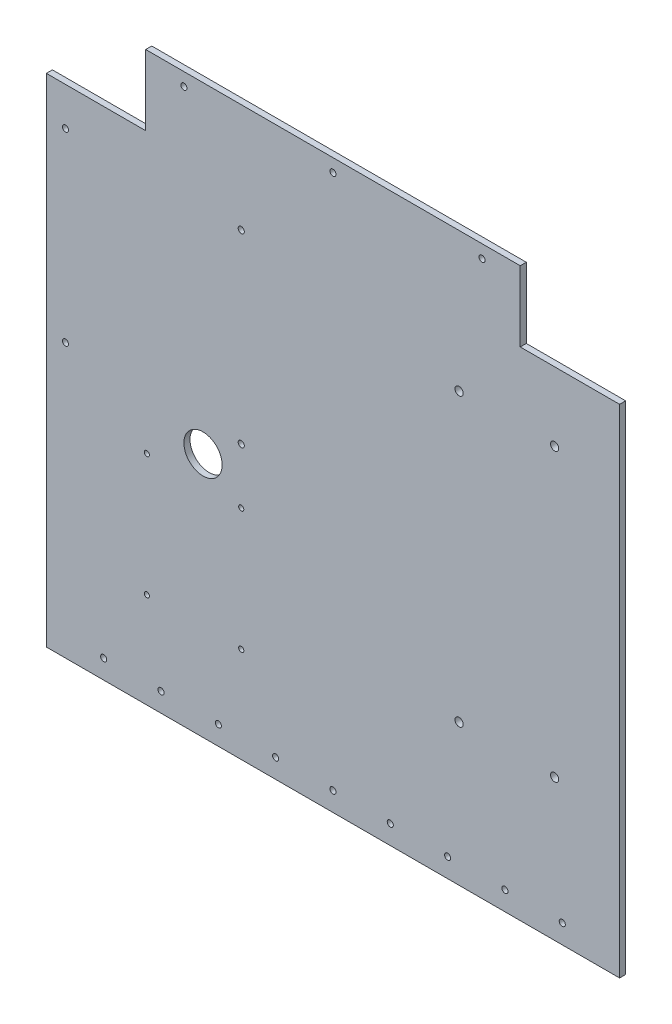
ISO-10303-21;
HEADER;
FILE_DESCRIPTION(('STEP AP214'),'2;1');
FILE_NAME('part.step','',(''),(''),'','','');
FILE_SCHEMA(('AUTOMOTIVE_DESIGN { 1 0 10303 214 1 1 1 1 }'));
ENDSEC;
DATA;
#1=APPLICATION_CONTEXT('core data for automotive mechanical design processes');
#2=APPLICATION_PROTOCOL_DEFINITION('international standard','automotive_design',2000,#1);
#3=PRODUCT_CONTEXT('',#1,'mechanical');
#4=PRODUCT('Part','Part','',(#3));
#5=PRODUCT_RELATED_PRODUCT_CATEGORY('part','',(#4));
#6=PRODUCT_DEFINITION_FORMATION('','',#4);
#7=PRODUCT_DEFINITION_CONTEXT('part definition',#1,'design');
#8=PRODUCT_DEFINITION('design','',#6,#7);
#9=PRODUCT_DEFINITION_SHAPE('','',#8);
#10=(LENGTH_UNIT() NAMED_UNIT(*) SI_UNIT(.MILLI.,.METRE.));
#11=(NAMED_UNIT(*) PLANE_ANGLE_UNIT() SI_UNIT($,.RADIAN.));
#12=(NAMED_UNIT(*) SI_UNIT($,.STERADIAN.) SOLID_ANGLE_UNIT());
#13=UNCERTAINTY_MEASURE_WITH_UNIT(LENGTH_MEASURE(1.E-05),#10,'distance_accuracy_value','');
#14=(GEOMETRIC_REPRESENTATION_CONTEXT(3) GLOBAL_UNCERTAINTY_ASSIGNED_CONTEXT((#13)) GLOBAL_UNIT_ASSIGNED_CONTEXT((#10,
#11,#12)) REPRESENTATION_CONTEXT('',''));
#15=CARTESIAN_POINT('',(0.,0.,0.));
#16=DIRECTION('',(0.,0.,1.));
#17=DIRECTION('',(1.,0.,0.));
#18=AXIS2_PLACEMENT_3D('',#15,#16,#17);
#19=CARTESIAN_POINT('',(0.,0.,0.));
#20=DIRECTION('',(0.,0.,1.));
#21=DIRECTION('',(1.,0.,0.));
#22=AXIS2_PLACEMENT_3D('',#19,#20,#21);
#23=PLANE('',#22);
#24=DIRECTION('',(1.,0.,0.));
#25=VECTOR('',#24,1.);
#26=CARTESIAN_POINT('',(0.,-3.19999999999999,0.));
#27=LINE('',#26,#25);
#28=CARTESIAN_POINT('',(52.,-3.19999999999999,0.));
#29=VERTEX_POINT('',#28);
#30=CARTESIAN_POINT('',(248.,-3.19999999999999,0.));
#31=VERTEX_POINT('',#30);
#32=EDGE_CURVE('E115',#29,#31,#27,.T.);
#33=ORIENTED_EDGE('',*,*,#32,.F.);
#34=DIRECTION('',(0.,1.,0.));
#35=VECTOR('',#34,1.);
#36=CARTESIAN_POINT('',(52.,0.,0.));
#37=LINE('',#36,#35);
#38=CARTESIAN_POINT('',(52.,-40.,0.));
#39=VERTEX_POINT('',#38);
#40=EDGE_CURVE('E166',#39,#29,#37,.T.);
#41=ORIENTED_EDGE('',*,*,#40,.F.);
#42=DIRECTION('',(1.,0.,0.));
#43=VECTOR('',#42,1.);
#44=CARTESIAN_POINT('',(0.,-40.,0.));
#45=LINE('',#44,#43);
#46=CARTESIAN_POINT('',(0.,-40.,0.));
#47=VERTEX_POINT('',#46);
#48=EDGE_CURVE('E57',#47,#39,#45,.T.);
#49=ORIENTED_EDGE('',*,*,#48,.F.);
#50=DIRECTION('',(0.,1.,0.));
#51=VECTOR('',#50,1.);
#52=CARTESIAN_POINT('',(0.,0.,0.));
#53=LINE('',#52,#51);
#54=CARTESIAN_POINT('',(0.,-300.,0.));
#55=VERTEX_POINT('',#54);
#56=EDGE_CURVE('E150',#55,#47,#53,.T.);
#57=ORIENTED_EDGE('',*,*,#56,.F.);
#58=DIRECTION('',(-1.,0.,0.));
#59=VECTOR('',#58,1.);
#60=CARTESIAN_POINT('',(0.,-300.,0.));
#61=LINE('',#60,#59);
#62=CARTESIAN_POINT('',(300.,-300.,0.));
#63=VERTEX_POINT('',#62);
#64=EDGE_CURVE('E145',#63,#55,#61,.T.);
#65=ORIENTED_EDGE('',*,*,#64,.F.);
#66=DIRECTION('',(0.,-1.,0.));
#67=VECTOR('',#66,1.);
#68=CARTESIAN_POINT('',(300.,0.,0.));
#69=LINE('',#68,#67);
#70=CARTESIAN_POINT('',(300.,-40.,0.));
#71=VERTEX_POINT('',#70);
#72=EDGE_CURVE('E153',#71,#63,#69,.T.);
#73=ORIENTED_EDGE('',*,*,#72,.F.);
#74=DIRECTION('',(1.,0.,0.));
#75=VECTOR('',#74,1.);
#76=CARTESIAN_POINT('',(0.,-39.9999999999999,0.));
#77=LINE('',#76,#75);
#78=CARTESIAN_POINT('',(248.,-40.,0.));
#79=VERTEX_POINT('',#78);
#80=EDGE_CURVE('E162',#79,#71,#77,.T.);
#81=ORIENTED_EDGE('',*,*,#80,.F.);
#82=DIRECTION('',(0.,-1.,0.));
#83=VECTOR('',#82,1.);
#84=CARTESIAN_POINT('',(248.,0.,0.));
#85=LINE('',#84,#83);
#86=EDGE_CURVE('E164',#31,#79,#85,.T.);
#87=ORIENTED_EDGE('',*,*,#86,.F.);
#88=EDGE_LOOP('',(#33,#41,#49,#57,#65,#73,#81,#87));
#89=FACE_BOUND('',#88,.T.);
#90=CARTESIAN_POINT('',(82.,-171.5,0.));
#91=DIRECTION('',(0.,0.,1.));
#92=DIRECTION('',(1.,0.,0.));
#93=AXIS2_PLACEMENT_3D('',#90,#91,#92);
#94=CIRCLE('',#93,10.);
#95=CARTESIAN_POINT('',(92.,-171.5,0.));
#96=VERTEX_POINT('',#95);
#97=EDGE_CURVE('E346',#96,#96,#94,.T.);
#98=ORIENTED_EDGE('',*,*,#97,.F.);
#99=EDGE_LOOP('',(#98));
#100=FACE_BOUND('',#99,.T.);
#101=CARTESIAN_POINT('',(228.,-10.,0.));
#102=DIRECTION('',(0.,0.,-1.));
#103=DIRECTION('',(-1.,0.,0.));
#104=AXIS2_PLACEMENT_3D('',#101,#102,#103);
#105=CIRCLE('',#104,1.59999999999999);
#106=CARTESIAN_POINT('',(226.4,-10.,0.));
#107=VERTEX_POINT('',#106);
#108=EDGE_CURVE('E340',#107,#107,#105,.T.);
#109=ORIENTED_EDGE('',*,*,#108,.T.);
#110=EDGE_LOOP('',(#109));
#111=FACE_BOUND('',#110,.T.);
#112=CARTESIAN_POINT('',(150.,-10.,0.));
#113=DIRECTION('',(0.,0.,-1.));
#114=DIRECTION('',(-1.,0.,0.));
#115=AXIS2_PLACEMENT_3D('',#112,#113,#114);
#116=CIRCLE('',#115,1.59999999999999);
#117=CARTESIAN_POINT('',(148.4,-10.,0.));
#118=VERTEX_POINT('',#117);
#119=EDGE_CURVE('E334',#118,#118,#116,.T.);
#120=ORIENTED_EDGE('',*,*,#119,.T.);
#121=EDGE_LOOP('',(#120));
#122=FACE_BOUND('',#121,.T.);
#123=CARTESIAN_POINT('',(270.,-290.,0.));
#124=DIRECTION('',(0.,0.,-1.));
#125=DIRECTION('',(-1.,0.,0.));
#126=AXIS2_PLACEMENT_3D('',#123,#124,#125);
#127=CIRCLE('',#126,1.59999999999999);
#128=CARTESIAN_POINT('',(268.4,-290.,0.));
#129=VERTEX_POINT('',#128);
#130=EDGE_CURVE('E322',#129,#129,#127,.T.);
#131=ORIENTED_EDGE('',*,*,#130,.T.);
#132=EDGE_LOOP('',(#131));
#133=FACE_BOUND('',#132,.T.);
#134=CARTESIAN_POINT('',(240.,-290.,0.));
#135=DIRECTION('',(0.,0.,-1.));
#136=DIRECTION('',(-1.,0.,0.));
#137=AXIS2_PLACEMENT_3D('',#134,#135,#136);
#138=CIRCLE('',#137,1.59999999999999);
#139=CARTESIAN_POINT('',(238.4,-290.,0.));
#140=VERTEX_POINT('',#139);
#141=EDGE_CURVE('E316',#140,#140,#138,.T.);
#142=ORIENTED_EDGE('',*,*,#141,.T.);
#143=EDGE_LOOP('',(#142));
#144=FACE_BOUND('',#143,.T.);
#145=CARTESIAN_POINT('',(180.,-290.,0.));
#146=DIRECTION('',(0.,0.,-1.));
#147=DIRECTION('',(-1.,0.,0.));
#148=AXIS2_PLACEMENT_3D('',#145,#146,#147);
#149=CIRCLE('',#148,1.59999999999999);
#150=CARTESIAN_POINT('',(178.4,-290.,0.));
#151=VERTEX_POINT('',#150);
#152=EDGE_CURVE('E304',#151,#151,#149,.T.);
#153=ORIENTED_EDGE('',*,*,#152,.T.);
#154=EDGE_LOOP('',(#153));
#155=FACE_BOUND('',#154,.T.);
#156=CARTESIAN_POINT('',(90.,-290.,0.));
#157=DIRECTION('',(0.,0.,-1.));
#158=DIRECTION('',(-1.,0.,0.));
#159=AXIS2_PLACEMENT_3D('',#156,#157,#158);
#160=CIRCLE('',#159,1.6);
#161=CARTESIAN_POINT('',(88.4,-290.,0.));
#162=VERTEX_POINT('',#161);
#163=EDGE_CURVE('E286',#162,#162,#160,.T.);
#164=ORIENTED_EDGE('',*,*,#163,.T.);
#165=EDGE_LOOP('',(#164));
#166=FACE_BOUND('',#165,.T.);
#167=CARTESIAN_POINT('',(102.,-186.,0.));
#168=DIRECTION('',(0.,0.,-1.));
#169=DIRECTION('',(-1.,0.,0.));
#170=AXIS2_PLACEMENT_3D('',#167,#168,#169);
#171=CIRCLE('',#170,1.35);
#172=CARTESIAN_POINT('',(100.65,-186.,0.));
#173=VERTEX_POINT('',#172);
#174=EDGE_CURVE('E268',#173,#173,#171,.T.);
#175=ORIENTED_EDGE('',*,*,#174,.T.);
#176=EDGE_LOOP('',(#175));
#177=FACE_BOUND('',#176,.T.);
#178=CARTESIAN_POINT('',(52.6,-250.,0.));
#179=DIRECTION('',(0.,0.,-1.));
#180=DIRECTION('',(-1.,0.,0.));
#181=AXIS2_PLACEMENT_3D('',#178,#179,#180);
#182=CIRCLE('',#181,1.35);
#183=CARTESIAN_POINT('',(51.25,-250.,0.));
#184=VERTEX_POINT('',#183);
#185=EDGE_CURVE('E262',#184,#184,#182,.T.);
#186=ORIENTED_EDGE('',*,*,#185,.T.);
#187=EDGE_LOOP('',(#186));
#188=FACE_BOUND('',#187,.T.);
#189=CARTESIAN_POINT('',(102.,-250.,0.));
#190=DIRECTION('',(0.,0.,-1.));
#191=DIRECTION('',(-1.,0.,0.));
#192=AXIS2_PLACEMENT_3D('',#189,#190,#191);
#193=CIRCLE('',#192,1.35);
#194=CARTESIAN_POINT('',(100.65,-250.,0.));
#195=VERTEX_POINT('',#194);
#196=EDGE_CURVE('E256',#195,#195,#193,.T.);
#197=ORIENTED_EDGE('',*,*,#196,.T.);
#198=EDGE_LOOP('',(#197));
#199=FACE_BOUND('',#198,.T.);
#200=CARTESIAN_POINT('',(52.6,-186.,0.));
#201=DIRECTION('',(0.,0.,-1.));
#202=DIRECTION('',(-1.,0.,0.));
#203=AXIS2_PLACEMENT_3D('',#200,#201,#202);
#204=CIRCLE('',#203,1.35);
#205=CARTESIAN_POINT('',(51.25,-186.,0.));
#206=VERTEX_POINT('',#205);
#207=EDGE_CURVE('E250',#206,#206,#204,.T.);
#208=ORIENTED_EDGE('',*,*,#207,.T.);
#209=EDGE_LOOP('',(#208));
#210=FACE_BOUND('',#209,.T.);
#211=CARTESIAN_POINT('',(102.,-60.,0.));
#212=DIRECTION('',(0.,0.,-1.));
#213=DIRECTION('',(-1.,0.,0.));
#214=AXIS2_PLACEMENT_3D('',#211,#212,#213);
#215=CIRCLE('',#214,1.6);
#216=CARTESIAN_POINT('',(100.4,-60.,0.));
#217=VERTEX_POINT('',#216);
#218=EDGE_CURVE('E244',#217,#217,#215,.T.);
#219=ORIENTED_EDGE('',*,*,#218,.T.);
#220=EDGE_LOOP('',(#219));
#221=FACE_BOUND('',#220,.T.);
#222=CARTESIAN_POINT('',(9.99999999999999,-157.,0.));
#223=DIRECTION('',(0.,0.,-1.));
#224=DIRECTION('',(-1.,0.,0.));
#225=AXIS2_PLACEMENT_3D('',#222,#223,#224);
#226=CIRCLE('',#225,1.6);
#227=CARTESIAN_POINT('',(8.39999999999999,-157.,0.));
#228=VERTEX_POINT('',#227);
#229=EDGE_CURVE('E238',#228,#228,#226,.T.);
#230=ORIENTED_EDGE('',*,*,#229,.T.);
#231=EDGE_LOOP('',(#230));
#232=FACE_BOUND('',#231,.T.);
#233=CARTESIAN_POINT('',(102.,-157.,0.));
#234=DIRECTION('',(0.,0.,-1.));
#235=DIRECTION('',(-1.,0.,0.));
#236=AXIS2_PLACEMENT_3D('',#233,#234,#235);
#237=CIRCLE('',#236,1.6);
#238=CARTESIAN_POINT('',(100.4,-157.,0.));
#239=VERTEX_POINT('',#238);
#240=EDGE_CURVE('E232',#239,#239,#237,.T.);
#241=ORIENTED_EDGE('',*,*,#240,.T.);
#242=EDGE_LOOP('',(#241));
#243=FACE_BOUND('',#242,.T.);
#244=CARTESIAN_POINT('',(9.99999999999999,-60.,0.));
#245=DIRECTION('',(0.,0.,-1.));
#246=DIRECTION('',(-1.,0.,0.));
#247=AXIS2_PLACEMENT_3D('',#244,#245,#246);
#248=CIRCLE('',#247,1.6);
#249=CARTESIAN_POINT('',(8.4,-60.,0.));
#250=VERTEX_POINT('',#249);
#251=EDGE_CURVE('E226',#250,#250,#248,.T.);
#252=ORIENTED_EDGE('',*,*,#251,.T.);
#253=EDGE_LOOP('',(#252));
#254=FACE_BOUND('',#253,.T.);
#255=CARTESIAN_POINT('',(266.,-76.,0.));
#256=DIRECTION('',(0.,0.,-1.));
#257=DIRECTION('',(0.,1.,0.));
#258=AXIS2_PLACEMENT_3D('',#255,#256,#257);
#259=CIRCLE('',#258,2.14999999999999);
#260=CARTESIAN_POINT('',(266.,-73.85,0.));
#261=VERTEX_POINT('',#260);
#262=EDGE_CURVE('E220',#261,#261,#259,.T.);
#263=ORIENTED_EDGE('',*,*,#262,.T.);
#264=EDGE_LOOP('',(#263));
#265=FACE_BOUND('',#264,.T.);
#266=CARTESIAN_POINT('',(216.,-226.,0.));
#267=DIRECTION('',(0.,0.,-1.));
#268=DIRECTION('',(0.,1.,0.));
#269=AXIS2_PLACEMENT_3D('',#266,#267,#268);
#270=CIRCLE('',#269,2.15000000000001);
#271=CARTESIAN_POINT('',(216.,-223.85,0.));
#272=VERTEX_POINT('',#271);
#273=EDGE_CURVE('E214',#272,#272,#270,.T.);
#274=ORIENTED_EDGE('',*,*,#273,.T.);
#275=EDGE_LOOP('',(#274));
#276=FACE_BOUND('',#275,.T.);
#277=CARTESIAN_POINT('',(216.,-76.,0.));
#278=DIRECTION('',(0.,0.,-1.));
#279=DIRECTION('',(0.,1.,0.));
#280=AXIS2_PLACEMENT_3D('',#277,#278,#279);
#281=CIRCLE('',#280,2.15000000000001);
#282=CARTESIAN_POINT('',(216.,-73.85,0.));
#283=VERTEX_POINT('',#282);
#284=EDGE_CURVE('E205',#283,#283,#281,.T.);
#285=ORIENTED_EDGE('',*,*,#284,.T.);
#286=EDGE_LOOP('',(#285));
#287=FACE_BOUND('',#286,.T.);
#288=CARTESIAN_POINT('',(266.,-226.,0.));
#289=DIRECTION('',(0.,0.,-1.));
#290=DIRECTION('',(0.,1.,0.));
#291=AXIS2_PLACEMENT_3D('',#288,#289,#290);
#292=CIRCLE('',#291,2.14999999999999);
#293=CARTESIAN_POINT('',(266.,-223.85,0.));
#294=VERTEX_POINT('',#293);
#295=EDGE_CURVE('E180',#294,#294,#292,.T.);
#296=ORIENTED_EDGE('',*,*,#295,.T.);
#297=EDGE_LOOP('',(#296));
#298=FACE_BOUND('',#297,.T.);
#299=CARTESIAN_POINT('',(30.,-290.,0.));
#300=DIRECTION('',(0.,0.,-1.));
#301=DIRECTION('',(-1.,0.,0.));
#302=AXIS2_PLACEMENT_3D('',#299,#300,#301);
#303=CIRCLE('',#302,1.6);
#304=CARTESIAN_POINT('',(28.4,-290.,0.));
#305=VERTEX_POINT('',#304);
#306=EDGE_CURVE('E274',#305,#305,#303,.T.);
#307=ORIENTED_EDGE('',*,*,#306,.T.);
#308=EDGE_LOOP('',(#307));
#309=FACE_BOUND('',#308,.T.);
#310=CARTESIAN_POINT('',(60.,-290.,0.));
#311=DIRECTION('',(0.,0.,-1.));
#312=DIRECTION('',(-1.,0.,0.));
#313=AXIS2_PLACEMENT_3D('',#310,#311,#312);
#314=CIRCLE('',#313,1.6);
#315=CARTESIAN_POINT('',(58.4,-290.,0.));
#316=VERTEX_POINT('',#315);
#317=EDGE_CURVE('E280',#316,#316,#314,.T.);
#318=ORIENTED_EDGE('',*,*,#317,.T.);
#319=EDGE_LOOP('',(#318));
#320=FACE_BOUND('',#319,.T.);
#321=CARTESIAN_POINT('',(120.,-290.,0.));
#322=DIRECTION('',(0.,0.,-1.));
#323=DIRECTION('',(-1.,0.,0.));
#324=AXIS2_PLACEMENT_3D('',#321,#322,#323);
#325=CIRCLE('',#324,1.6);
#326=CARTESIAN_POINT('',(118.4,-290.,0.));
#327=VERTEX_POINT('',#326);
#328=EDGE_CURVE('E292',#327,#327,#325,.T.);
#329=ORIENTED_EDGE('',*,*,#328,.T.);
#330=EDGE_LOOP('',(#329));
#331=FACE_BOUND('',#330,.T.);
#332=CARTESIAN_POINT('',(150.,-290.,0.));
#333=DIRECTION('',(0.,0.,-1.));
#334=DIRECTION('',(-1.,0.,0.));
#335=AXIS2_PLACEMENT_3D('',#332,#333,#334);
#336=CIRCLE('',#335,1.59999999999999);
#337=CARTESIAN_POINT('',(148.4,-290.,0.));
#338=VERTEX_POINT('',#337);
#339=EDGE_CURVE('E298',#338,#338,#336,.T.);
#340=ORIENTED_EDGE('',*,*,#339,.T.);
#341=EDGE_LOOP('',(#340));
#342=FACE_BOUND('',#341,.T.);
#343=CARTESIAN_POINT('',(210.,-290.,0.));
#344=DIRECTION('',(0.,0.,-1.));
#345=DIRECTION('',(-1.,0.,0.));
#346=AXIS2_PLACEMENT_3D('',#343,#344,#345);
#347=CIRCLE('',#346,1.59999999999999);
#348=CARTESIAN_POINT('',(208.4,-290.,0.));
#349=VERTEX_POINT('',#348);
#350=EDGE_CURVE('E310',#349,#349,#347,.T.);
#351=ORIENTED_EDGE('',*,*,#350,.T.);
#352=EDGE_LOOP('',(#351));
#353=FACE_BOUND('',#352,.T.);
#354=CARTESIAN_POINT('',(72.,-10.,0.));
#355=DIRECTION('',(0.,0.,-1.));
#356=DIRECTION('',(-1.,0.,0.));
#357=AXIS2_PLACEMENT_3D('',#354,#355,#356);
#358=CIRCLE('',#357,1.6);
#359=CARTESIAN_POINT('',(70.4,-10.,0.));
#360=VERTEX_POINT('',#359);
#361=EDGE_CURVE('E328',#360,#360,#358,.T.);
#362=ORIENTED_EDGE('',*,*,#361,.T.);
#363=EDGE_LOOP('',(#362));
#364=FACE_BOUND('',#363,.T.);
#365=ADVANCED_FACE('F49',(#89,#100,#111,#122,#133,#144,#155,#166,#177,#188,#199,#210,#221,#232,
#243,#254,#265,#276,#287,#298,#309,#320,#331,#342,#353,#364),#23,.T.);
#366=CARTESIAN_POINT('',(0.,0.,-3.175));
#367=DIRECTION('',(0.,0.,1.));
#368=DIRECTION('',(1.,0.,0.));
#369=AXIS2_PLACEMENT_3D('',#366,#367,#368);
#370=PLANE('',#369);
#371=CARTESIAN_POINT('',(82.,-171.5,-3.175));
#372=DIRECTION('',(0.,0.,-1.));
#373=DIRECTION('',(-1.,0.,0.));
#374=AXIS2_PLACEMENT_3D('',#371,#372,#373);
#375=CIRCLE('',#374,10.);
#376=CARTESIAN_POINT('',(72.,-171.5,-3.175));
#377=VERTEX_POINT('',#376);
#378=EDGE_CURVE('E349',#377,#377,#375,.T.);
#379=ORIENTED_EDGE('',*,*,#378,.F.);
#380=EDGE_LOOP('',(#379));
#381=FACE_BOUND('',#380,.T.);
#382=CARTESIAN_POINT('',(228.,-10.,-3.175));
#383=DIRECTION('',(0.,0.,-1.));
#384=DIRECTION('',(-1.,0.,0.));
#385=AXIS2_PLACEMENT_3D('',#382,#383,#384);
#386=CIRCLE('',#385,1.59999999999999);
#387=CARTESIAN_POINT('',(226.4,-10.,-3.175));
#388=VERTEX_POINT('',#387);
#389=EDGE_CURVE('E343',#388,#388,#386,.T.);
#390=ORIENTED_EDGE('',*,*,#389,.F.);
#391=EDGE_LOOP('',(#390));
#392=FACE_BOUND('',#391,.T.);
#393=CARTESIAN_POINT('',(150.,-10.,-3.175));
#394=DIRECTION('',(0.,0.,-1.));
#395=DIRECTION('',(-1.,0.,0.));
#396=AXIS2_PLACEMENT_3D('',#393,#394,#395);
#397=CIRCLE('',#396,1.59999999999999);
#398=CARTESIAN_POINT('',(148.4,-10.,-3.175));
#399=VERTEX_POINT('',#398);
#400=EDGE_CURVE('E337',#399,#399,#397,.T.);
#401=ORIENTED_EDGE('',*,*,#400,.F.);
#402=EDGE_LOOP('',(#401));
#403=FACE_BOUND('',#402,.T.);
#404=CARTESIAN_POINT('',(270.,-290.,-3.175));
#405=DIRECTION('',(0.,0.,-1.));
#406=DIRECTION('',(-1.,0.,0.));
#407=AXIS2_PLACEMENT_3D('',#404,#405,#406);
#408=CIRCLE('',#407,1.59999999999999);
#409=CARTESIAN_POINT('',(268.4,-290.,-3.175));
#410=VERTEX_POINT('',#409);
#411=EDGE_CURVE('E325',#410,#410,#408,.T.);
#412=ORIENTED_EDGE('',*,*,#411,.F.);
#413=EDGE_LOOP('',(#412));
#414=FACE_BOUND('',#413,.T.);
#415=CARTESIAN_POINT('',(240.,-290.,-3.175));
#416=DIRECTION('',(0.,0.,-1.));
#417=DIRECTION('',(-1.,0.,0.));
#418=AXIS2_PLACEMENT_3D('',#415,#416,#417);
#419=CIRCLE('',#418,1.59999999999999);
#420=CARTESIAN_POINT('',(238.4,-290.,-3.175));
#421=VERTEX_POINT('',#420);
#422=EDGE_CURVE('E319',#421,#421,#419,.T.);
#423=ORIENTED_EDGE('',*,*,#422,.F.);
#424=EDGE_LOOP('',(#423));
#425=FACE_BOUND('',#424,.T.);
#426=CARTESIAN_POINT('',(210.,-290.,-3.175));
#427=DIRECTION('',(0.,0.,-1.));
#428=DIRECTION('',(-1.,0.,0.));
#429=AXIS2_PLACEMENT_3D('',#426,#427,#428);
#430=CIRCLE('',#429,1.59999999999999);
#431=CARTESIAN_POINT('',(208.4,-290.,-3.175));
#432=VERTEX_POINT('',#431);
#433=EDGE_CURVE('E313',#432,#432,#430,.T.);
#434=ORIENTED_EDGE('',*,*,#433,.F.);
#435=EDGE_LOOP('',(#434));
#436=FACE_BOUND('',#435,.T.);
#437=CARTESIAN_POINT('',(180.,-290.,-3.175));
#438=DIRECTION('',(0.,0.,-1.));
#439=DIRECTION('',(-1.,0.,0.));
#440=AXIS2_PLACEMENT_3D('',#437,#438,#439);
#441=CIRCLE('',#440,1.59999999999999);
#442=CARTESIAN_POINT('',(178.4,-290.,-3.175));
#443=VERTEX_POINT('',#442);
#444=EDGE_CURVE('E307',#443,#443,#441,.T.);
#445=ORIENTED_EDGE('',*,*,#444,.F.);
#446=EDGE_LOOP('',(#445));
#447=FACE_BOUND('',#446,.T.);
#448=CARTESIAN_POINT('',(150.,-290.,-3.175));
#449=DIRECTION('',(0.,0.,-1.));
#450=DIRECTION('',(-1.,0.,0.));
#451=AXIS2_PLACEMENT_3D('',#448,#449,#450);
#452=CIRCLE('',#451,1.59999999999999);
#453=CARTESIAN_POINT('',(148.4,-290.,-3.175));
#454=VERTEX_POINT('',#453);
#455=EDGE_CURVE('E301',#454,#454,#452,.T.);
#456=ORIENTED_EDGE('',*,*,#455,.F.);
#457=EDGE_LOOP('',(#456));
#458=FACE_BOUND('',#457,.T.);
#459=CARTESIAN_POINT('',(120.,-290.,-3.175));
#460=DIRECTION('',(0.,0.,-1.));
#461=DIRECTION('',(-1.,0.,0.));
#462=AXIS2_PLACEMENT_3D('',#459,#460,#461);
#463=CIRCLE('',#462,1.6);
#464=CARTESIAN_POINT('',(118.4,-290.,-3.175));
#465=VERTEX_POINT('',#464);
#466=EDGE_CURVE('E295',#465,#465,#463,.T.);
#467=ORIENTED_EDGE('',*,*,#466,.F.);
#468=EDGE_LOOP('',(#467));
#469=FACE_BOUND('',#468,.T.);
#470=CARTESIAN_POINT('',(90.,-290.,-3.175));
#471=DIRECTION('',(0.,0.,-1.));
#472=DIRECTION('',(-1.,0.,0.));
#473=AXIS2_PLACEMENT_3D('',#470,#471,#472);
#474=CIRCLE('',#473,1.6);
#475=CARTESIAN_POINT('',(88.4,-290.,-3.175));
#476=VERTEX_POINT('',#475);
#477=EDGE_CURVE('E289',#476,#476,#474,.T.);
#478=ORIENTED_EDGE('',*,*,#477,.F.);
#479=EDGE_LOOP('',(#478));
#480=FACE_BOUND('',#479,.T.);
#481=CARTESIAN_POINT('',(60.,-290.,-3.175));
#482=DIRECTION('',(0.,0.,-1.));
#483=DIRECTION('',(-1.,0.,0.));
#484=AXIS2_PLACEMENT_3D('',#481,#482,#483);
#485=CIRCLE('',#484,1.6);
#486=CARTESIAN_POINT('',(58.4,-290.,-3.175));
#487=VERTEX_POINT('',#486);
#488=EDGE_CURVE('E283',#487,#487,#485,.T.);
#489=ORIENTED_EDGE('',*,*,#488,.F.);
#490=EDGE_LOOP('',(#489));
#491=FACE_BOUND('',#490,.T.);
#492=CARTESIAN_POINT('',(30.,-290.,-3.175));
#493=DIRECTION('',(0.,0.,-1.));
#494=DIRECTION('',(-1.,0.,0.));
#495=AXIS2_PLACEMENT_3D('',#492,#493,#494);
#496=CIRCLE('',#495,1.6);
#497=CARTESIAN_POINT('',(28.4,-290.,-3.175));
#498=VERTEX_POINT('',#497);
#499=EDGE_CURVE('E277',#498,#498,#496,.T.);
#500=ORIENTED_EDGE('',*,*,#499,.F.);
#501=EDGE_LOOP('',(#500));
#502=FACE_BOUND('',#501,.T.);
#503=CARTESIAN_POINT('',(102.,-186.,-3.175));
#504=DIRECTION('',(0.,0.,-1.));
#505=DIRECTION('',(-1.,0.,0.));
#506=AXIS2_PLACEMENT_3D('',#503,#504,#505);
#507=CIRCLE('',#506,1.35);
#508=CARTESIAN_POINT('',(100.65,-186.,-3.175));
#509=VERTEX_POINT('',#508);
#510=EDGE_CURVE('E271',#509,#509,#507,.T.);
#511=ORIENTED_EDGE('',*,*,#510,.F.);
#512=EDGE_LOOP('',(#511));
#513=FACE_BOUND('',#512,.T.);
#514=CARTESIAN_POINT('',(52.6,-250.,-3.175));
#515=DIRECTION('',(0.,0.,-1.));
#516=DIRECTION('',(-1.,0.,0.));
#517=AXIS2_PLACEMENT_3D('',#514,#515,#516);
#518=CIRCLE('',#517,1.35);
#519=CARTESIAN_POINT('',(51.25,-250.,-3.175));
#520=VERTEX_POINT('',#519);
#521=EDGE_CURVE('E265',#520,#520,#518,.T.);
#522=ORIENTED_EDGE('',*,*,#521,.F.);
#523=EDGE_LOOP('',(#522));
#524=FACE_BOUND('',#523,.T.);
#525=CARTESIAN_POINT('',(102.,-250.,-3.175));
#526=DIRECTION('',(0.,0.,-1.));
#527=DIRECTION('',(-1.,0.,0.));
#528=AXIS2_PLACEMENT_3D('',#525,#526,#527);
#529=CIRCLE('',#528,1.35);
#530=CARTESIAN_POINT('',(100.65,-250.,-3.175));
#531=VERTEX_POINT('',#530);
#532=EDGE_CURVE('E259',#531,#531,#529,.T.);
#533=ORIENTED_EDGE('',*,*,#532,.F.);
#534=EDGE_LOOP('',(#533));
#535=FACE_BOUND('',#534,.T.);
#536=CARTESIAN_POINT('',(52.6,-186.,-3.175));
#537=DIRECTION('',(0.,0.,-1.));
#538=DIRECTION('',(-1.,0.,0.));
#539=AXIS2_PLACEMENT_3D('',#536,#537,#538);
#540=CIRCLE('',#539,1.35);
#541=CARTESIAN_POINT('',(51.25,-186.,-3.175));
#542=VERTEX_POINT('',#541);
#543=EDGE_CURVE('E253',#542,#542,#540,.T.);
#544=ORIENTED_EDGE('',*,*,#543,.F.);
#545=EDGE_LOOP('',(#544));
#546=FACE_BOUND('',#545,.T.);
#547=CARTESIAN_POINT('',(9.99999999999999,-157.,-3.175));
#548=DIRECTION('',(0.,0.,-1.));
#549=DIRECTION('',(-1.,0.,0.));
#550=AXIS2_PLACEMENT_3D('',#547,#548,#549);
#551=CIRCLE('',#550,1.6);
#552=CARTESIAN_POINT('',(8.39999999999999,-157.,-3.175));
#553=VERTEX_POINT('',#552);
#554=EDGE_CURVE('E241',#553,#553,#551,.T.);
#555=ORIENTED_EDGE('',*,*,#554,.F.);
#556=EDGE_LOOP('',(#555));
#557=FACE_BOUND('',#556,.T.);
#558=CARTESIAN_POINT('',(102.,-157.,-3.175));
#559=DIRECTION('',(0.,0.,-1.));
#560=DIRECTION('',(-1.,0.,0.));
#561=AXIS2_PLACEMENT_3D('',#558,#559,#560);
#562=CIRCLE('',#561,1.6);
#563=CARTESIAN_POINT('',(100.4,-157.,-3.175));
#564=VERTEX_POINT('',#563);
#565=EDGE_CURVE('E235',#564,#564,#562,.T.);
#566=ORIENTED_EDGE('',*,*,#565,.F.);
#567=EDGE_LOOP('',(#566));
#568=FACE_BOUND('',#567,.T.);
#569=CARTESIAN_POINT('',(9.99999999999999,-60.,-3.175));
#570=DIRECTION('',(0.,0.,-1.));
#571=DIRECTION('',(-1.,0.,0.));
#572=AXIS2_PLACEMENT_3D('',#569,#570,#571);
#573=CIRCLE('',#572,1.6);
#574=CARTESIAN_POINT('',(8.4,-60.,-3.175));
#575=VERTEX_POINT('',#574);
#576=EDGE_CURVE('E229',#575,#575,#573,.T.);
#577=ORIENTED_EDGE('',*,*,#576,.F.);
#578=EDGE_LOOP('',(#577));
#579=FACE_BOUND('',#578,.T.);
#580=CARTESIAN_POINT('',(266.,-76.,-3.17500000000001));
#581=DIRECTION('',(0.,0.,-1.));
#582=DIRECTION('',(0.,1.,0.));
#583=AXIS2_PLACEMENT_3D('',#580,#581,#582);
#584=CIRCLE('',#583,2.14999999999999);
#585=CARTESIAN_POINT('',(266.,-73.85,-3.17500000000001));
#586=VERTEX_POINT('',#585);
#587=EDGE_CURVE('E223',#586,#586,#584,.T.);
#588=ORIENTED_EDGE('',*,*,#587,.F.);
#589=EDGE_LOOP('',(#588));
#590=FACE_BOUND('',#589,.T.);
#591=CARTESIAN_POINT('',(216.,-226.,-3.17500000000001));
#592=DIRECTION('',(0.,0.,-1.));
#593=DIRECTION('',(0.,1.,0.));
#594=AXIS2_PLACEMENT_3D('',#591,#592,#593);
#595=CIRCLE('',#594,2.14999999999999);
#596=CARTESIAN_POINT('',(216.,-223.85,-3.17500000000001));
#597=VERTEX_POINT('',#596);
#598=EDGE_CURVE('E217',#597,#597,#595,.T.);
#599=ORIENTED_EDGE('',*,*,#598,.F.);
#600=EDGE_LOOP('',(#599));
#601=FACE_BOUND('',#600,.T.);
#602=CARTESIAN_POINT('',(216.,-76.,-3.17500000000001));
#603=DIRECTION('',(0.,0.,-1.));
#604=DIRECTION('',(0.,1.,0.));
#605=AXIS2_PLACEMENT_3D('',#602,#603,#604);
#606=CIRCLE('',#605,2.14999999999999);
#607=CARTESIAN_POINT('',(216.,-73.85,-3.17500000000001));
#608=VERTEX_POINT('',#607);
#609=EDGE_CURVE('E209',#608,#608,#606,.T.);
#610=ORIENTED_EDGE('',*,*,#609,.F.);
#611=EDGE_LOOP('',(#610));
#612=FACE_BOUND('',#611,.T.);
#613=CARTESIAN_POINT('',(266.,-226.,-3.17500000000001));
#614=DIRECTION('',(0.,0.,-1.));
#615=DIRECTION('',(0.,1.,0.));
#616=AXIS2_PLACEMENT_3D('',#613,#614,#615);
#617=CIRCLE('',#616,2.14999999999999);
#618=CARTESIAN_POINT('',(266.,-223.85,-3.17500000000001));
#619=VERTEX_POINT('',#618);
#620=EDGE_CURVE('E201',#619,#619,#617,.T.);
#621=ORIENTED_EDGE('',*,*,#620,.F.);
#622=EDGE_LOOP('',(#621));
#623=FACE_BOUND('',#622,.T.);
#624=DIRECTION('',(0.,-1.,0.));
#625=VECTOR('',#624,1.);
#626=CARTESIAN_POINT('',(52.,-40.,-3.175));
#627=LINE('',#626,#625);
#628=CARTESIAN_POINT('',(52.,-3.19999999999999,-3.175));
#629=VERTEX_POINT('',#628);
#630=CARTESIAN_POINT('',(52.,-40.,-3.175));
#631=VERTEX_POINT('',#630);
#632=EDGE_CURVE('E128',#629,#631,#627,.T.);
#633=ORIENTED_EDGE('',*,*,#632,.F.);
#634=DIRECTION('',(-1.,0.,0.));
#635=VECTOR('',#634,1.);
#636=CARTESIAN_POINT('',(248.,-3.19999999999999,-3.175));
#637=LINE('',#636,#635);
#638=CARTESIAN_POINT('',(248.,-3.19999999999999,-3.175));
#639=VERTEX_POINT('',#638);
#640=EDGE_CURVE('E64',#639,#629,#637,.T.);
#641=ORIENTED_EDGE('',*,*,#640,.F.);
#642=DIRECTION('',(0.,1.,0.));
#643=VECTOR('',#642,1.);
#644=CARTESIAN_POINT('',(248.,-40.,-3.175));
#645=LINE('',#644,#643);
#646=CARTESIAN_POINT('',(248.,-40.,-3.175));
#647=VERTEX_POINT('',#646);
#648=EDGE_CURVE('E126',#647,#639,#645,.T.);
#649=ORIENTED_EDGE('',*,*,#648,.F.);
#650=DIRECTION('',(-1.,0.,0.));
#651=VECTOR('',#650,1.);
#652=CARTESIAN_POINT('',(300.,-40.,-3.175));
#653=LINE('',#652,#651);
#654=CARTESIAN_POINT('',(300.,-40.,-3.175));
#655=VERTEX_POINT('',#654);
#656=EDGE_CURVE('E134',#655,#647,#653,.T.);
#657=ORIENTED_EDGE('',*,*,#656,.F.);
#658=DIRECTION('',(0.,-1.,0.));
#659=VECTOR('',#658,1.);
#660=CARTESIAN_POINT('',(300.,0.,-3.175));
#661=LINE('',#660,#659);
#662=CARTESIAN_POINT('',(300.,-300.,-3.175));
#663=VERTEX_POINT('',#662);
#664=EDGE_CURVE('E144',#655,#663,#661,.T.);
#665=ORIENTED_EDGE('',*,*,#664,.T.);
#666=DIRECTION('',(-1.,0.,0.));
#667=VECTOR('',#666,1.);
#668=CARTESIAN_POINT('',(0.,-300.,-3.175));
#669=LINE('',#668,#667);
#670=CARTESIAN_POINT('',(0.,-300.,-3.175));
#671=VERTEX_POINT('',#670);
#672=EDGE_CURVE('E147',#663,#671,#669,.T.);
#673=ORIENTED_EDGE('',*,*,#672,.T.);
#674=DIRECTION('',(0.,1.,0.));
#675=VECTOR('',#674,1.);
#676=CARTESIAN_POINT('',(0.,0.,-3.175));
#677=LINE('',#676,#675);
#678=CARTESIAN_POINT('',(0.,-40.,-3.175));
#679=VERTEX_POINT('',#678);
#680=EDGE_CURVE('E141',#671,#679,#677,.T.);
#681=ORIENTED_EDGE('',*,*,#680,.T.);
#682=DIRECTION('',(-1.,0.,0.));
#683=VECTOR('',#682,1.);
#684=CARTESIAN_POINT('',(0.,-40.,-3.175));
#685=LINE('',#684,#683);
#686=EDGE_CURVE('E176',#631,#679,#685,.T.);
#687=ORIENTED_EDGE('',*,*,#686,.F.);
#688=EDGE_LOOP('',(#633,#641,#649,#657,#665,#673,#681,#687));
#689=FACE_BOUND('',#688,.T.);
#690=CARTESIAN_POINT('',(102.,-60.,-3.175));
#691=DIRECTION('',(0.,0.,-1.));
#692=DIRECTION('',(-1.,0.,0.));
#693=AXIS2_PLACEMENT_3D('',#690,#691,#692);
#694=CIRCLE('',#693,1.6);
#695=CARTESIAN_POINT('',(100.4,-60.,-3.175));
#696=VERTEX_POINT('',#695);
#697=EDGE_CURVE('E247',#696,#696,#694,.T.);
#698=ORIENTED_EDGE('',*,*,#697,.F.);
#699=EDGE_LOOP('',(#698));
#700=FACE_BOUND('',#699,.T.);
#701=CARTESIAN_POINT('',(72.,-10.,-3.175));
#702=DIRECTION('',(0.,0.,-1.));
#703=DIRECTION('',(-1.,0.,0.));
#704=AXIS2_PLACEMENT_3D('',#701,#702,#703);
#705=CIRCLE('',#704,1.59999999999999);
#706=CARTESIAN_POINT('',(70.4,-10.,-3.175));
#707=VERTEX_POINT('',#706);
#708=EDGE_CURVE('E331',#707,#707,#705,.T.);
#709=ORIENTED_EDGE('',*,*,#708,.F.);
#710=EDGE_LOOP('',(#709));
#711=FACE_BOUND('',#710,.T.);
#712=ADVANCED_FACE('F123',(#381,#392,#403,#414,#425,#436,#447,#458,#469,#480,#491,#502,#513,
#524,#535,#546,#557,#568,#579,#590,#601,#612,#623,#689,#700,#711),#370,.F.);
#713=CARTESIAN_POINT('',(0.,0.,-3.175));
#714=DIRECTION('',(1.,0.,0.));
#715=DIRECTION('',(0.,0.,-1.));
#716=AXIS2_PLACEMENT_3D('',#713,#714,#715);
#717=PLANE('',#716);
#718=ORIENTED_EDGE('',*,*,#56,.T.);
#719=DIRECTION('',(0.,0.,-1.));
#720=VECTOR('',#719,1.);
#721=CARTESIAN_POINT('',(0.,-40.,6.825));
#722=LINE('',#721,#720);
#723=EDGE_CURVE('E154',#47,#679,#722,.T.);
#724=ORIENTED_EDGE('',*,*,#723,.T.);
#725=ORIENTED_EDGE('',*,*,#680,.F.);
#726=DIRECTION('',(0.,0.,1.));
#727=VECTOR('',#726,1.);
#728=CARTESIAN_POINT('',(0.,-300.,-3.175));
#729=LINE('',#728,#727);
#730=EDGE_CURVE('E149',#671,#55,#729,.T.);
#731=ORIENTED_EDGE('',*,*,#730,.T.);
#732=EDGE_LOOP('',(#718,#724,#725,#731));
#733=FACE_BOUND('',#732,.T.);
#734=ADVANCED_FACE('F51',(#733),#717,.F.);
#735=CARTESIAN_POINT('',(300.,0.,-3.175));
#736=DIRECTION('',(-1.,0.,0.));
#737=DIRECTION('',(0.,0.,1.));
#738=AXIS2_PLACEMENT_3D('',#735,#736,#737);
#739=PLANE('',#738);
#740=ORIENTED_EDGE('',*,*,#664,.F.);
#741=DIRECTION('',(0.,0.,-1.));
#742=VECTOR('',#741,1.);
#743=CARTESIAN_POINT('',(300.,-40.,6.825));
#744=LINE('',#743,#742);
#745=EDGE_CURVE('E135',#71,#655,#744,.T.);
#746=ORIENTED_EDGE('',*,*,#745,.F.);
#747=ORIENTED_EDGE('',*,*,#72,.T.);
#748=DIRECTION('',(0.,0.,1.));
#749=VECTOR('',#748,1.);
#750=CARTESIAN_POINT('',(300.,-300.,-3.175));
#751=LINE('',#750,#749);
#752=EDGE_CURVE('E159',#663,#63,#751,.T.);
#753=ORIENTED_EDGE('',*,*,#752,.F.);
#754=EDGE_LOOP('',(#740,#746,#747,#753));
#755=FACE_BOUND('',#754,.T.);
#756=ADVANCED_FACE('F197',(#755),#739,.F.);
#757=CARTESIAN_POINT('',(0.,-300.,-3.175));
#758=DIRECTION('',(0.,1.,0.));
#759=DIRECTION('',(0.,0.,1.));
#760=AXIS2_PLACEMENT_3D('',#757,#758,#759);
#761=PLANE('',#760);
#762=ORIENTED_EDGE('',*,*,#64,.T.);
#763=ORIENTED_EDGE('',*,*,#730,.F.);
#764=ORIENTED_EDGE('',*,*,#672,.F.);
#765=ORIENTED_EDGE('',*,*,#752,.T.);
#766=EDGE_LOOP('',(#762,#763,#764,#765));
#767=FACE_BOUND('',#766,.T.);
#768=ADVANCED_FACE('F191',(#767),#761,.F.);
#769=CARTESIAN_POINT('',(248.,-40.,6.825));
#770=DIRECTION('',(-1.,0.,0.));
#771=DIRECTION('',(0.,0.,1.));
#772=AXIS2_PLACEMENT_3D('',#769,#770,#771);
#773=PLANE('',#772);
#774=ORIENTED_EDGE('',*,*,#648,.T.);
#775=DIRECTION('',(0.,0.,-1.));
#776=VECTOR('',#775,1.);
#777=CARTESIAN_POINT('',(248.,-3.19999999999999,6.825));
#778=LINE('',#777,#776);
#779=EDGE_CURVE('E112',#31,#639,#778,.T.);
#780=ORIENTED_EDGE('',*,*,#779,.F.);
#781=ORIENTED_EDGE('',*,*,#86,.T.);
#782=DIRECTION('',(0.,0.,-1.));
#783=VECTOR('',#782,1.);
#784=CARTESIAN_POINT('',(248.,-40.,6.825));
#785=LINE('',#784,#783);
#786=EDGE_CURVE('E132',#79,#647,#785,.T.);
#787=ORIENTED_EDGE('',*,*,#786,.T.);
#788=EDGE_LOOP('',(#774,#780,#781,#787));
#789=FACE_BOUND('',#788,.T.);
#790=ADVANCED_FACE('F130',(#789),#773,.F.);
#791=CARTESIAN_POINT('',(300.,-40.,6.825));
#792=DIRECTION('',(0.,-1.,0.));
#793=DIRECTION('',(1.,0.,0.));
#794=AXIS2_PLACEMENT_3D('',#791,#792,#793);
#795=PLANE('',#794);
#796=ORIENTED_EDGE('',*,*,#80,.T.);
#797=ORIENTED_EDGE('',*,*,#745,.T.);
#798=ORIENTED_EDGE('',*,*,#656,.T.);
#799=ORIENTED_EDGE('',*,*,#786,.F.);
#800=EDGE_LOOP('',(#796,#797,#798,#799));
#801=FACE_BOUND('',#800,.T.);
#802=ADVANCED_FACE('F199',(#801),#795,.F.);
#803=CARTESIAN_POINT('',(0.,-40.,6.825));
#804=DIRECTION('',(0.,-1.,0.));
#805=DIRECTION('',(1.,0.,0.));
#806=AXIS2_PLACEMENT_3D('',#803,#804,#805);
#807=PLANE('',#806);
#808=ORIENTED_EDGE('',*,*,#48,.T.);
#809=DIRECTION('',(0.,0.,-1.));
#810=VECTOR('',#809,1.);
#811=CARTESIAN_POINT('',(52.,-40.,6.825));
#812=LINE('',#811,#810);
#813=EDGE_CURVE('E71',#39,#631,#812,.T.);
#814=ORIENTED_EDGE('',*,*,#813,.T.);
#815=ORIENTED_EDGE('',*,*,#686,.T.);
#816=ORIENTED_EDGE('',*,*,#723,.F.);
#817=EDGE_LOOP('',(#808,#814,#815,#816));
#818=FACE_BOUND('',#817,.T.);
#819=ADVANCED_FACE('F170',(#818),#807,.F.);
#820=CARTESIAN_POINT('',(52.,-40.,6.825));
#821=DIRECTION('',(1.,0.,0.));
#822=DIRECTION('',(0.,1.,0.));
#823=AXIS2_PLACEMENT_3D('',#820,#821,#822);
#824=PLANE('',#823);
#825=ORIENTED_EDGE('',*,*,#40,.T.);
#826=DIRECTION('',(0.,0.,-1.));
#827=VECTOR('',#826,1.);
#828=CARTESIAN_POINT('',(52.,-3.19999999999999,6.825));
#829=LINE('',#828,#827);
#830=EDGE_CURVE('E11',#29,#629,#829,.T.);
#831=ORIENTED_EDGE('',*,*,#830,.T.);
#832=ORIENTED_EDGE('',*,*,#632,.T.);
#833=ORIENTED_EDGE('',*,*,#813,.F.);
#834=EDGE_LOOP('',(#825,#831,#832,#833));
#835=FACE_BOUND('',#834,.T.);
#836=ADVANCED_FACE('F175',(#835),#824,.F.);
#837=CARTESIAN_POINT('',(266.,-226.,-3.17500000000001));
#838=DIRECTION('',(0.,0.,-1.));
#839=DIRECTION('',(0.,1.,0.));
#840=AXIS2_PLACEMENT_3D('',#837,#838,#839);
#841=CYLINDRICAL_SURFACE('',#840,2.14999999999999);
#842=ORIENTED_EDGE('',*,*,#295,.F.);
#843=EDGE_LOOP('',(#842));
#844=FACE_BOUND('',#843,.T.);
#845=ORIENTED_EDGE('',*,*,#620,.T.);
#846=EDGE_LOOP('',(#845));
#847=FACE_BOUND('',#846,.T.);
#848=ADVANCED_FACE('F405',(#844,#847),#841,.F.);
#849=CARTESIAN_POINT('',(216.,-76.,-3.175));
#850=DIRECTION('',(0.,0.,-1.));
#851=DIRECTION('',(0.,1.,0.));
#852=AXIS2_PLACEMENT_3D('',#849,#850,#851);
#853=CYLINDRICAL_SURFACE('',#852,2.15);
#854=ORIENTED_EDGE('',*,*,#284,.F.);
#855=EDGE_LOOP('',(#854));
#856=FACE_BOUND('',#855,.T.);
#857=ORIENTED_EDGE('',*,*,#609,.T.);
#858=EDGE_LOOP('',(#857));
#859=FACE_BOUND('',#858,.T.);
#860=ADVANCED_FACE('F402',(#856,#859),#853,.F.);
#861=CARTESIAN_POINT('',(216.,-226.,-3.17500000000001));
#862=DIRECTION('',(0.,0.,-1.));
#863=DIRECTION('',(0.,1.,0.));
#864=AXIS2_PLACEMENT_3D('',#861,#862,#863);
#865=CYLINDRICAL_SURFACE('',#864,2.15);
#866=ORIENTED_EDGE('',*,*,#273,.F.);
#867=EDGE_LOOP('',(#866));
#868=FACE_BOUND('',#867,.T.);
#869=ORIENTED_EDGE('',*,*,#598,.T.);
#870=EDGE_LOOP('',(#869));
#871=FACE_BOUND('',#870,.T.);
#872=ADVANCED_FACE('F404',(#868,#871),#865,.F.);
#873=CARTESIAN_POINT('',(266.,-76.,-3.175));
#874=DIRECTION('',(0.,0.,-1.));
#875=DIRECTION('',(0.,1.,0.));
#876=AXIS2_PLACEMENT_3D('',#873,#874,#875);
#877=CYLINDRICAL_SURFACE('',#876,2.14999999999999);
#878=ORIENTED_EDGE('',*,*,#262,.F.);
#879=EDGE_LOOP('',(#878));
#880=FACE_BOUND('',#879,.T.);
#881=ORIENTED_EDGE('',*,*,#587,.T.);
#882=EDGE_LOOP('',(#881));
#883=FACE_BOUND('',#882,.T.);
#884=ADVANCED_FACE('F412',(#880,#883),#877,.F.);
#885=CARTESIAN_POINT('',(9.99999999999999,-60.,-3.175));
#886=DIRECTION('',(0.,0.,-1.));
#887=DIRECTION('',(-1.,0.,0.));
#888=AXIS2_PLACEMENT_3D('',#885,#886,#887);
#889=CYLINDRICAL_SURFACE('',#888,1.6);
#890=ORIENTED_EDGE('',*,*,#251,.F.);
#891=EDGE_LOOP('',(#890));
#892=FACE_BOUND('',#891,.T.);
#893=ORIENTED_EDGE('',*,*,#576,.T.);
#894=EDGE_LOOP('',(#893));
#895=FACE_BOUND('',#894,.T.);
#896=ADVANCED_FACE('F623',(#892,#895),#889,.F.);
#897=CARTESIAN_POINT('',(102.,-157.,-3.175));
#898=DIRECTION('',(0.,0.,-1.));
#899=DIRECTION('',(-1.,0.,0.));
#900=AXIS2_PLACEMENT_3D('',#897,#898,#899);
#901=CYLINDRICAL_SURFACE('',#900,1.6);
#902=ORIENTED_EDGE('',*,*,#240,.F.);
#903=EDGE_LOOP('',(#902));
#904=FACE_BOUND('',#903,.T.);
#905=ORIENTED_EDGE('',*,*,#565,.T.);
#906=EDGE_LOOP('',(#905));
#907=FACE_BOUND('',#906,.T.);
#908=ADVANCED_FACE('F614',(#904,#907),#901,.F.);
#909=CARTESIAN_POINT('',(9.99999999999999,-157.,-3.175));
#910=DIRECTION('',(0.,0.,-1.));
#911=DIRECTION('',(-1.,0.,0.));
#912=AXIS2_PLACEMENT_3D('',#909,#910,#911);
#913=CYLINDRICAL_SURFACE('',#912,1.6);
#914=ORIENTED_EDGE('',*,*,#229,.F.);
#915=EDGE_LOOP('',(#914));
#916=FACE_BOUND('',#915,.T.);
#917=ORIENTED_EDGE('',*,*,#554,.T.);
#918=EDGE_LOOP('',(#917));
#919=FACE_BOUND('',#918,.T.);
#920=ADVANCED_FACE('F605',(#916,#919),#913,.F.);
#921=CARTESIAN_POINT('',(102.,-60.,-3.175));
#922=DIRECTION('',(0.,0.,-1.));
#923=DIRECTION('',(-1.,0.,0.));
#924=AXIS2_PLACEMENT_3D('',#921,#922,#923);
#925=CYLINDRICAL_SURFACE('',#924,1.6);
#926=ORIENTED_EDGE('',*,*,#218,.F.);
#927=EDGE_LOOP('',(#926));
#928=FACE_BOUND('',#927,.T.);
#929=ORIENTED_EDGE('',*,*,#697,.T.);
#930=EDGE_LOOP('',(#929));
#931=FACE_BOUND('',#930,.T.);
#932=ADVANCED_FACE('F596',(#928,#931),#925,.F.);
#933=CARTESIAN_POINT('',(52.6,-186.,-3.175));
#934=DIRECTION('',(0.,0.,-1.));
#935=DIRECTION('',(-1.,0.,0.));
#936=AXIS2_PLACEMENT_3D('',#933,#934,#935);
#937=CYLINDRICAL_SURFACE('',#936,1.35);
#938=ORIENTED_EDGE('',*,*,#207,.F.);
#939=EDGE_LOOP('',(#938));
#940=FACE_BOUND('',#939,.T.);
#941=ORIENTED_EDGE('',*,*,#543,.T.);
#942=EDGE_LOOP('',(#941));
#943=FACE_BOUND('',#942,.T.);
#944=ADVANCED_FACE('F587',(#940,#943),#937,.F.);
#945=CARTESIAN_POINT('',(102.,-250.,-3.175));
#946=DIRECTION('',(0.,0.,-1.));
#947=DIRECTION('',(-1.,0.,0.));
#948=AXIS2_PLACEMENT_3D('',#945,#946,#947);
#949=CYLINDRICAL_SURFACE('',#948,1.35);
#950=ORIENTED_EDGE('',*,*,#196,.F.);
#951=EDGE_LOOP('',(#950));
#952=FACE_BOUND('',#951,.T.);
#953=ORIENTED_EDGE('',*,*,#532,.T.);
#954=EDGE_LOOP('',(#953));
#955=FACE_BOUND('',#954,.T.);
#956=ADVANCED_FACE('F578',(#952,#955),#949,.F.);
#957=CARTESIAN_POINT('',(52.6,-250.,-3.175));
#958=DIRECTION('',(0.,0.,-1.));
#959=DIRECTION('',(-1.,0.,0.));
#960=AXIS2_PLACEMENT_3D('',#957,#958,#959);
#961=CYLINDRICAL_SURFACE('',#960,1.35);
#962=ORIENTED_EDGE('',*,*,#185,.F.);
#963=EDGE_LOOP('',(#962));
#964=FACE_BOUND('',#963,.T.);
#965=ORIENTED_EDGE('',*,*,#521,.T.);
#966=EDGE_LOOP('',(#965));
#967=FACE_BOUND('',#966,.T.);
#968=ADVANCED_FACE('F569',(#964,#967),#961,.F.);
#969=CARTESIAN_POINT('',(102.,-186.,-3.175));
#970=DIRECTION('',(0.,0.,-1.));
#971=DIRECTION('',(-1.,0.,0.));
#972=AXIS2_PLACEMENT_3D('',#969,#970,#971);
#973=CYLINDRICAL_SURFACE('',#972,1.35);
#974=ORIENTED_EDGE('',*,*,#174,.F.);
#975=EDGE_LOOP('',(#974));
#976=FACE_BOUND('',#975,.T.);
#977=ORIENTED_EDGE('',*,*,#510,.T.);
#978=EDGE_LOOP('',(#977));
#979=FACE_BOUND('',#978,.T.);
#980=ADVANCED_FACE('F560',(#976,#979),#973,.F.);
#981=CARTESIAN_POINT('',(30.,-290.,-3.175));
#982=DIRECTION('',(0.,0.,-1.));
#983=DIRECTION('',(-1.,0.,0.));
#984=AXIS2_PLACEMENT_3D('',#981,#982,#983);
#985=CYLINDRICAL_SURFACE('',#984,1.6);
#986=ORIENTED_EDGE('',*,*,#306,.F.);
#987=EDGE_LOOP('',(#986));
#988=FACE_BOUND('',#987,.T.);
#989=ORIENTED_EDGE('',*,*,#499,.T.);
#990=EDGE_LOOP('',(#989));
#991=FACE_BOUND('',#990,.T.);
#992=ADVANCED_FACE('F551',(#988,#991),#985,.F.);
#993=CARTESIAN_POINT('',(60.,-290.,-3.175));
#994=DIRECTION('',(0.,0.,-1.));
#995=DIRECTION('',(-1.,0.,0.));
#996=AXIS2_PLACEMENT_3D('',#993,#994,#995);
#997=CYLINDRICAL_SURFACE('',#996,1.6);
#998=ORIENTED_EDGE('',*,*,#317,.F.);
#999=EDGE_LOOP('',(#998));
#1000=FACE_BOUND('',#999,.T.);
#1001=ORIENTED_EDGE('',*,*,#488,.T.);
#1002=EDGE_LOOP('',(#1001));
#1003=FACE_BOUND('',#1002,.T.);
#1004=ADVANCED_FACE('F542',(#1000,#1003),#997,.F.);
#1005=CARTESIAN_POINT('',(90.,-290.,-3.175));
#1006=DIRECTION('',(0.,0.,-1.));
#1007=DIRECTION('',(-1.,0.,0.));
#1008=AXIS2_PLACEMENT_3D('',#1005,#1006,#1007);
#1009=CYLINDRICAL_SURFACE('',#1008,1.6);
#1010=ORIENTED_EDGE('',*,*,#163,.F.);
#1011=EDGE_LOOP('',(#1010));
#1012=FACE_BOUND('',#1011,.T.);
#1013=ORIENTED_EDGE('',*,*,#477,.T.);
#1014=EDGE_LOOP('',(#1013));
#1015=FACE_BOUND('',#1014,.T.);
#1016=ADVANCED_FACE('F533',(#1012,#1015),#1009,.F.);
#1017=CARTESIAN_POINT('',(120.,-290.,-3.175));
#1018=DIRECTION('',(0.,0.,-1.));
#1019=DIRECTION('',(-1.,0.,0.));
#1020=AXIS2_PLACEMENT_3D('',#1017,#1018,#1019);
#1021=CYLINDRICAL_SURFACE('',#1020,1.6);
#1022=ORIENTED_EDGE('',*,*,#328,.F.);
#1023=EDGE_LOOP('',(#1022));
#1024=FACE_BOUND('',#1023,.T.);
#1025=ORIENTED_EDGE('',*,*,#466,.T.);
#1026=EDGE_LOOP('',(#1025));
#1027=FACE_BOUND('',#1026,.T.);
#1028=ADVANCED_FACE('F524',(#1024,#1027),#1021,.F.);
#1029=CARTESIAN_POINT('',(150.,-290.,-3.175));
#1030=DIRECTION('',(0.,0.,-1.));
#1031=DIRECTION('',(-1.,0.,0.));
#1032=AXIS2_PLACEMENT_3D('',#1029,#1030,#1031);
#1033=CYLINDRICAL_SURFACE('',#1032,1.59999999999999);
#1034=ORIENTED_EDGE('',*,*,#339,.F.);
#1035=EDGE_LOOP('',(#1034));
#1036=FACE_BOUND('',#1035,.T.);
#1037=ORIENTED_EDGE('',*,*,#455,.T.);
#1038=EDGE_LOOP('',(#1037));
#1039=FACE_BOUND('',#1038,.T.);
#1040=ADVANCED_FACE('F515',(#1036,#1039),#1033,.F.);
#1041=CARTESIAN_POINT('',(180.,-290.,-3.175));
#1042=DIRECTION('',(0.,0.,-1.));
#1043=DIRECTION('',(-1.,0.,0.));
#1044=AXIS2_PLACEMENT_3D('',#1041,#1042,#1043);
#1045=CYLINDRICAL_SURFACE('',#1044,1.59999999999999);
#1046=ORIENTED_EDGE('',*,*,#152,.F.);
#1047=EDGE_LOOP('',(#1046));
#1048=FACE_BOUND('',#1047,.T.);
#1049=ORIENTED_EDGE('',*,*,#444,.T.);
#1050=EDGE_LOOP('',(#1049));
#1051=FACE_BOUND('',#1050,.T.);
#1052=ADVANCED_FACE('F506',(#1048,#1051),#1045,.F.);
#1053=CARTESIAN_POINT('',(210.,-290.,-3.175));
#1054=DIRECTION('',(0.,0.,-1.));
#1055=DIRECTION('',(-1.,0.,0.));
#1056=AXIS2_PLACEMENT_3D('',#1053,#1054,#1055);
#1057=CYLINDRICAL_SURFACE('',#1056,1.59999999999999);
#1058=ORIENTED_EDGE('',*,*,#350,.F.);
#1059=EDGE_LOOP('',(#1058));
#1060=FACE_BOUND('',#1059,.T.);
#1061=ORIENTED_EDGE('',*,*,#433,.T.);
#1062=EDGE_LOOP('',(#1061));
#1063=FACE_BOUND('',#1062,.T.);
#1064=ADVANCED_FACE('F497',(#1060,#1063),#1057,.F.);
#1065=CARTESIAN_POINT('',(240.,-290.,-3.175));
#1066=DIRECTION('',(0.,0.,-1.));
#1067=DIRECTION('',(-1.,0.,0.));
#1068=AXIS2_PLACEMENT_3D('',#1065,#1066,#1067);
#1069=CYLINDRICAL_SURFACE('',#1068,1.59999999999999);
#1070=ORIENTED_EDGE('',*,*,#141,.F.);
#1071=EDGE_LOOP('',(#1070));
#1072=FACE_BOUND('',#1071,.T.);
#1073=ORIENTED_EDGE('',*,*,#422,.T.);
#1074=EDGE_LOOP('',(#1073));
#1075=FACE_BOUND('',#1074,.T.);
#1076=ADVANCED_FACE('F488',(#1072,#1075),#1069,.F.);
#1077=CARTESIAN_POINT('',(270.,-290.,-3.175));
#1078=DIRECTION('',(0.,0.,-1.));
#1079=DIRECTION('',(-1.,0.,0.));
#1080=AXIS2_PLACEMENT_3D('',#1077,#1078,#1079);
#1081=CYLINDRICAL_SURFACE('',#1080,1.59999999999999);
#1082=ORIENTED_EDGE('',*,*,#130,.F.);
#1083=EDGE_LOOP('',(#1082));
#1084=FACE_BOUND('',#1083,.T.);
#1085=ORIENTED_EDGE('',*,*,#411,.T.);
#1086=EDGE_LOOP('',(#1085));
#1087=FACE_BOUND('',#1086,.T.);
#1088=ADVANCED_FACE('F479',(#1084,#1087),#1081,.F.);
#1089=CARTESIAN_POINT('',(72.,-10.,-3.175));
#1090=DIRECTION('',(0.,0.,-1.));
#1091=DIRECTION('',(-1.,0.,0.));
#1092=AXIS2_PLACEMENT_3D('',#1089,#1090,#1091);
#1093=CYLINDRICAL_SURFACE('',#1092,1.6);
#1094=ORIENTED_EDGE('',*,*,#361,.F.);
#1095=EDGE_LOOP('',(#1094));
#1096=FACE_BOUND('',#1095,.T.);
#1097=ORIENTED_EDGE('',*,*,#708,.T.);
#1098=EDGE_LOOP('',(#1097));
#1099=FACE_BOUND('',#1098,.T.);
#1100=ADVANCED_FACE('F471',(#1096,#1099),#1093,.F.);
#1101=CARTESIAN_POINT('',(150.,-10.,-3.175));
#1102=DIRECTION('',(0.,0.,-1.));
#1103=DIRECTION('',(-1.,0.,0.));
#1104=AXIS2_PLACEMENT_3D('',#1101,#1102,#1103);
#1105=CYLINDRICAL_SURFACE('',#1104,1.59999999999999);
#1106=ORIENTED_EDGE('',*,*,#119,.F.);
#1107=EDGE_LOOP('',(#1106));
#1108=FACE_BOUND('',#1107,.T.);
#1109=ORIENTED_EDGE('',*,*,#400,.T.);
#1110=EDGE_LOOP('',(#1109));
#1111=FACE_BOUND('',#1110,.T.);
#1112=ADVANCED_FACE('F462',(#1108,#1111),#1105,.F.);
#1113=CARTESIAN_POINT('',(228.,-10.,-3.175));
#1114=DIRECTION('',(0.,0.,-1.));
#1115=DIRECTION('',(-1.,0.,0.));
#1116=AXIS2_PLACEMENT_3D('',#1113,#1114,#1115);
#1117=CYLINDRICAL_SURFACE('',#1116,1.59999999999999);
#1118=ORIENTED_EDGE('',*,*,#108,.F.);
#1119=EDGE_LOOP('',(#1118));
#1120=FACE_BOUND('',#1119,.T.);
#1121=ORIENTED_EDGE('',*,*,#389,.T.);
#1122=EDGE_LOOP('',(#1121));
#1123=FACE_BOUND('',#1122,.T.);
#1124=ADVANCED_FACE('F452',(#1120,#1123),#1117,.F.);
#1125=CARTESIAN_POINT('',(82.,-171.5,6.825));
#1126=DIRECTION('',(0.,0.,-1.));
#1127=DIRECTION('',(-1.,0.,0.));
#1128=AXIS2_PLACEMENT_3D('',#1125,#1126,#1127);
#1129=CYLINDRICAL_SURFACE('',#1128,10.);
#1130=ORIENTED_EDGE('',*,*,#97,.T.);
#1131=EDGE_LOOP('',(#1130));
#1132=FACE_BOUND('',#1131,.T.);
#1133=ORIENTED_EDGE('',*,*,#378,.T.);
#1134=EDGE_LOOP('',(#1133));
#1135=FACE_BOUND('',#1134,.T.);
#1136=ADVANCED_FACE('F354',(#1132,#1135),#1129,.F.);
#1137=CARTESIAN_POINT('',(248.,-3.19999999999999,6.825));
#1138=DIRECTION('',(0.,-1.,0.));
#1139=DIRECTION('',(0.,0.,-1.));
#1140=AXIS2_PLACEMENT_3D('',#1137,#1138,#1139);
#1141=PLANE('',#1140);
#1142=ORIENTED_EDGE('',*,*,#32,.T.);
#1143=ORIENTED_EDGE('',*,*,#779,.T.);
#1144=ORIENTED_EDGE('',*,*,#640,.T.);
#1145=ORIENTED_EDGE('',*,*,#830,.F.);
#1146=EDGE_LOOP('',(#1142,#1143,#1144,#1145));
#1147=FACE_BOUND('',#1146,.T.);
#1148=ADVANCED_FACE('F113',(#1147),#1141,.F.);
#1149=CLOSED_SHELL('',(#365,#712,#734,#756,#768,#790,#802,#819,#836,#848,#860,#872,#884,#896,
#908,#920,#932,#944,#956,#968,#980,#992,#1004,#1016,#1028,#1040,#1052,#1064,#1076,#1088,#1100,
#1112,#1124,#1136,#1148));
#1150=MANIFOLD_SOLID_BREP('B2',#1149);
#1151=ADVANCED_BREP_SHAPE_REPRESENTATION('',(#18,#1150),#14);
#1152=SHAPE_DEFINITION_REPRESENTATION(#9,#1151);
ENDSEC;
END-ISO-10303-21;
